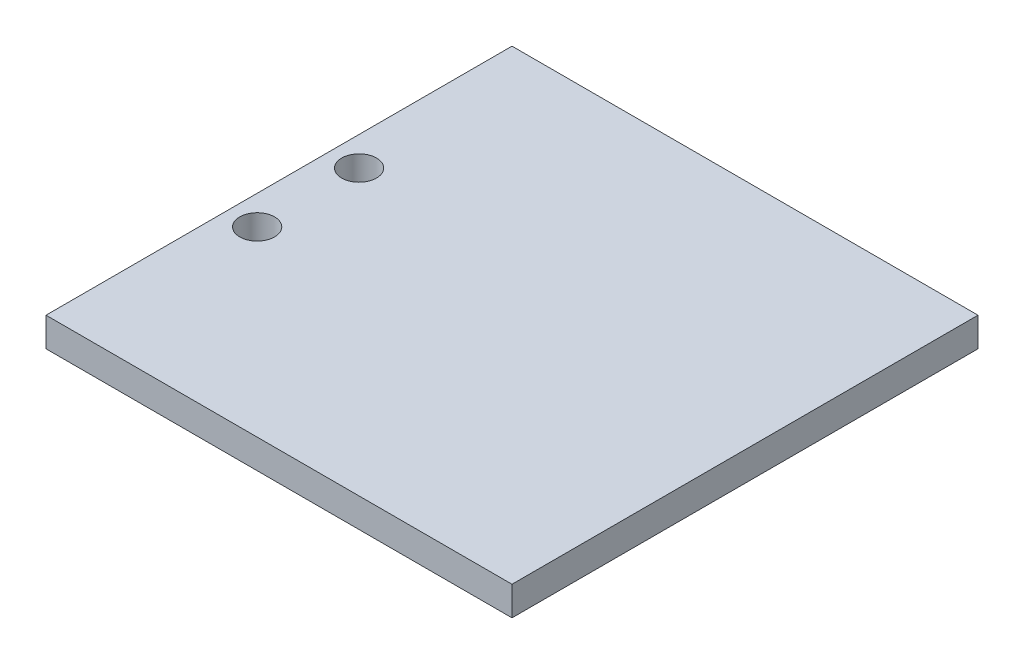
ISO-10303-21;
HEADER;
FILE_DESCRIPTION(('STEP AP214'),'2;1');
FILE_NAME('part.step','',(''),(''),'','','');
FILE_SCHEMA(('AUTOMOTIVE_DESIGN { 1 0 10303 214 1 1 1 1 }'));
ENDSEC;
DATA;
#1=APPLICATION_CONTEXT('core data for automotive mechanical design processes');
#2=APPLICATION_PROTOCOL_DEFINITION('international standard','automotive_design',2000,#1);
#3=PRODUCT_CONTEXT('',#1,'mechanical');
#4=PRODUCT('Part','Part','',(#3));
#5=PRODUCT_RELATED_PRODUCT_CATEGORY('part','',(#4));
#6=PRODUCT_DEFINITION_FORMATION('','',#4);
#7=PRODUCT_DEFINITION_CONTEXT('part definition',#1,'design');
#8=PRODUCT_DEFINITION('design','',#6,#7);
#9=PRODUCT_DEFINITION_SHAPE('','',#8);
#10=(LENGTH_UNIT() NAMED_UNIT(*) SI_UNIT(.MILLI.,.METRE.));
#11=(NAMED_UNIT(*) PLANE_ANGLE_UNIT() SI_UNIT($,.RADIAN.));
#12=(NAMED_UNIT(*) SI_UNIT($,.STERADIAN.) SOLID_ANGLE_UNIT());
#13=UNCERTAINTY_MEASURE_WITH_UNIT(LENGTH_MEASURE(1.E-05),#10,'distance_accuracy_value','');
#14=(GEOMETRIC_REPRESENTATION_CONTEXT(3) GLOBAL_UNCERTAINTY_ASSIGNED_CONTEXT((#13)) GLOBAL_UNIT_ASSIGNED_CONTEXT((#10,
#11,#12)) REPRESENTATION_CONTEXT('',''));
#15=CARTESIAN_POINT('',(0.,0.,0.));
#16=DIRECTION('',(0.,0.,1.));
#17=DIRECTION('',(1.,0.,0.));
#18=AXIS2_PLACEMENT_3D('',#15,#16,#17);
#19=CARTESIAN_POINT('',(25.4,3.175,-25.4));
#20=DIRECTION('',(-1.,0.,0.));
#21=DIRECTION('',(0.,0.,1.));
#22=AXIS2_PLACEMENT_3D('',#19,#20,#21);
#23=PLANE('',#22);
#24=DIRECTION('',(0.,0.,-1.));
#25=VECTOR('',#24,1.);
#26=CARTESIAN_POINT('',(25.4,0.,-25.4));
#27=LINE('',#26,#25);
#28=CARTESIAN_POINT('',(25.4,0.,25.4));
#29=VERTEX_POINT('',#28);
#30=CARTESIAN_POINT('',(25.4,0.,-25.4));
#31=VERTEX_POINT('',#30);
#32=EDGE_CURVE('E108',#29,#31,#27,.T.);
#33=ORIENTED_EDGE('',*,*,#32,.T.);
#34=DIRECTION('',(0.,-1.,0.));
#35=VECTOR('',#34,1.);
#36=CARTESIAN_POINT('',(25.4,3.175,-25.4));
#37=LINE('',#36,#35);
#38=CARTESIAN_POINT('',(25.4,3.175,-25.4));
#39=VERTEX_POINT('',#38);
#40=EDGE_CURVE('E11',#39,#31,#37,.T.);
#41=ORIENTED_EDGE('',*,*,#40,.F.);
#42=DIRECTION('',(0.,0.,-1.));
#43=VECTOR('',#42,1.);
#44=CARTESIAN_POINT('',(25.4,3.175,-25.4));
#45=LINE('',#44,#43);
#46=CARTESIAN_POINT('',(25.4,3.175,25.4));
#47=VERTEX_POINT('',#46);
#48=EDGE_CURVE('E91',#47,#39,#45,.T.);
#49=ORIENTED_EDGE('',*,*,#48,.F.);
#50=DIRECTION('',(0.,-1.,0.));
#51=VECTOR('',#50,1.);
#52=CARTESIAN_POINT('',(25.4,3.175,25.4));
#53=LINE('',#52,#51);
#54=EDGE_CURVE('E104',#47,#29,#53,.T.);
#55=ORIENTED_EDGE('',*,*,#54,.T.);
#56=EDGE_LOOP('',(#33,#41,#49,#55));
#57=FACE_BOUND('',#56,.T.);
#58=ADVANCED_FACE('F38',(#57),#23,.F.);
#59=CARTESIAN_POINT('',(-25.4,3.175,-25.4));
#60=DIRECTION('',(0.,0.,1.));
#61=DIRECTION('',(1.,0.,0.));
#62=AXIS2_PLACEMENT_3D('',#59,#60,#61);
#63=PLANE('',#62);
#64=DIRECTION('',(-1.,0.,0.));
#65=VECTOR('',#64,1.);
#66=CARTESIAN_POINT('',(-25.4,0.,-25.4));
#67=LINE('',#66,#65);
#68=CARTESIAN_POINT('',(-25.4,0.,-25.4));
#69=VERTEX_POINT('',#68);
#70=EDGE_CURVE('E96',#31,#69,#67,.T.);
#71=ORIENTED_EDGE('',*,*,#70,.T.);
#72=DIRECTION('',(0.,-1.,0.));
#73=VECTOR('',#72,1.);
#74=CARTESIAN_POINT('',(-25.4,3.175,-25.4));
#75=LINE('',#74,#73);
#76=CARTESIAN_POINT('',(-25.4,3.175,-25.4));
#77=VERTEX_POINT('',#76);
#78=EDGE_CURVE('E48',#77,#69,#75,.T.);
#79=ORIENTED_EDGE('',*,*,#78,.F.);
#80=DIRECTION('',(-1.,0.,0.));
#81=VECTOR('',#80,1.);
#82=CARTESIAN_POINT('',(-25.4,3.175,-25.4));
#83=LINE('',#82,#81);
#84=EDGE_CURVE('E86',#39,#77,#83,.T.);
#85=ORIENTED_EDGE('',*,*,#84,.F.);
#86=ORIENTED_EDGE('',*,*,#40,.T.);
#87=EDGE_LOOP('',(#71,#79,#85,#86));
#88=FACE_BOUND('',#87,.T.);
#89=ADVANCED_FACE('F95',(#88),#63,.F.);
#90=CARTESIAN_POINT('',(-25.4,3.175,-25.4));
#91=DIRECTION('',(1.,0.,0.));
#92=DIRECTION('',(0.,0.,-1.));
#93=AXIS2_PLACEMENT_3D('',#90,#91,#92);
#94=PLANE('',#93);
#95=DIRECTION('',(0.,0.,1.));
#96=VECTOR('',#95,1.);
#97=CARTESIAN_POINT('',(-25.4,0.,-25.4));
#98=LINE('',#97,#96);
#99=CARTESIAN_POINT('',(-25.4,0.,25.4));
#100=VERTEX_POINT('',#99);
#101=EDGE_CURVE('E73',#69,#100,#98,.T.);
#102=ORIENTED_EDGE('',*,*,#101,.T.);
#103=DIRECTION('',(0.,-1.,0.));
#104=VECTOR('',#103,1.);
#105=CARTESIAN_POINT('',(-25.4,3.175,25.4));
#106=LINE('',#105,#104);
#107=CARTESIAN_POINT('',(-25.4,3.175,25.4));
#108=VERTEX_POINT('',#107);
#109=EDGE_CURVE('E98',#108,#100,#106,.T.);
#110=ORIENTED_EDGE('',*,*,#109,.F.);
#111=DIRECTION('',(0.,0.,1.));
#112=VECTOR('',#111,1.);
#113=CARTESIAN_POINT('',(-25.4,3.175,-25.4));
#114=LINE('',#113,#112);
#115=EDGE_CURVE('E89',#77,#108,#114,.T.);
#116=ORIENTED_EDGE('',*,*,#115,.F.);
#117=ORIENTED_EDGE('',*,*,#78,.T.);
#118=EDGE_LOOP('',(#102,#110,#116,#117));
#119=FACE_BOUND('',#118,.T.);
#120=ADVANCED_FACE('F100',(#119),#94,.F.);
#121=CARTESIAN_POINT('',(-25.4,3.175,25.4));
#122=DIRECTION('',(0.,0.,-1.));
#123=DIRECTION('',(-1.,0.,0.));
#124=AXIS2_PLACEMENT_3D('',#121,#122,#123);
#125=PLANE('',#124);
#126=DIRECTION('',(1.,0.,0.));
#127=VECTOR('',#126,1.);
#128=CARTESIAN_POINT('',(-25.4,0.,25.4));
#129=LINE('',#128,#127);
#130=EDGE_CURVE('E79',#100,#29,#129,.T.);
#131=ORIENTED_EDGE('',*,*,#130,.T.);
#132=ORIENTED_EDGE('',*,*,#54,.F.);
#133=DIRECTION('',(1.,0.,0.));
#134=VECTOR('',#133,1.);
#135=CARTESIAN_POINT('',(-25.4,3.175,25.4));
#136=LINE('',#135,#134);
#137=EDGE_CURVE('E56',#108,#47,#136,.T.);
#138=ORIENTED_EDGE('',*,*,#137,.F.);
#139=ORIENTED_EDGE('',*,*,#109,.T.);
#140=EDGE_LOOP('',(#131,#132,#138,#139));
#141=FACE_BOUND('',#140,.T.);
#142=ADVANCED_FACE('F122',(#141),#125,.F.);
#143=CARTESIAN_POINT('',(0.,3.175,0.));
#144=DIRECTION('',(0.,1.,0.));
#145=DIRECTION('',(0.,0.,1.));
#146=AXIS2_PLACEMENT_3D('',#143,#144,#145);
#147=PLANE('',#146);
#148=CARTESIAN_POINT('',(-22.225,3.175,-5.55625));
#149=DIRECTION('',(0.,1.,0.));
#150=DIRECTION('',(0.,0.,1.));
#151=AXIS2_PLACEMENT_3D('',#148,#149,#150);
#152=CIRCLE('',#151,1.89864999999999);
#153=CARTESIAN_POINT('',(-22.225,3.175,-3.65760000000001));
#154=VERTEX_POINT('',#153);
#155=EDGE_CURVE('E136',#154,#154,#152,.T.);
#156=ORIENTED_EDGE('',*,*,#155,.F.);
#157=EDGE_LOOP('',(#156));
#158=FACE_BOUND('',#157,.T.);
#159=CARTESIAN_POINT('',(-22.225,3.175,5.55625));
#160=DIRECTION('',(0.,1.,0.));
#161=DIRECTION('',(0.,0.,1.));
#162=AXIS2_PLACEMENT_3D('',#159,#160,#161);
#163=CIRCLE('',#162,1.89864999999999);
#164=CARTESIAN_POINT('',(-22.225,3.175,7.45489999999999));
#165=VERTEX_POINT('',#164);
#166=EDGE_CURVE('E132',#165,#165,#163,.T.);
#167=ORIENTED_EDGE('',*,*,#166,.F.);
#168=EDGE_LOOP('',(#167));
#169=FACE_BOUND('',#168,.T.);
#170=ORIENTED_EDGE('',*,*,#48,.T.);
#171=ORIENTED_EDGE('',*,*,#84,.T.);
#172=ORIENTED_EDGE('',*,*,#115,.T.);
#173=ORIENTED_EDGE('',*,*,#137,.T.);
#174=EDGE_LOOP('',(#170,#171,#172,#173));
#175=FACE_BOUND('',#174,.T.);
#176=ADVANCED_FACE('F87',(#158,#169,#175),#147,.T.);
#177=CARTESIAN_POINT('',(0.,0.,0.));
#178=DIRECTION('',(0.,1.,0.));
#179=DIRECTION('',(0.,0.,1.));
#180=AXIS2_PLACEMENT_3D('',#177,#178,#179);
#181=PLANE('',#180);
#182=CARTESIAN_POINT('',(-22.225,0.,-5.55625));
#183=DIRECTION('',(0.,1.,0.));
#184=DIRECTION('',(0.,0.,1.));
#185=AXIS2_PLACEMENT_3D('',#182,#183,#184);
#186=CIRCLE('',#185,1.89864999999999);
#187=CARTESIAN_POINT('',(-22.225,0.,-3.65760000000001));
#188=VERTEX_POINT('',#187);
#189=EDGE_CURVE('E41',#188,#188,#186,.T.);
#190=ORIENTED_EDGE('',*,*,#189,.T.);
#191=EDGE_LOOP('',(#190));
#192=FACE_BOUND('',#191,.T.);
#193=CARTESIAN_POINT('',(-22.225,0.,5.55625));
#194=DIRECTION('',(0.,1.,0.));
#195=DIRECTION('',(0.,0.,1.));
#196=AXIS2_PLACEMENT_3D('',#193,#194,#195);
#197=CIRCLE('',#196,1.89864999999999);
#198=CARTESIAN_POINT('',(-22.225,0.,7.45489999999999));
#199=VERTEX_POINT('',#198);
#200=EDGE_CURVE('E112',#199,#199,#197,.T.);
#201=ORIENTED_EDGE('',*,*,#200,.T.);
#202=EDGE_LOOP('',(#201));
#203=FACE_BOUND('',#202,.T.);
#204=ORIENTED_EDGE('',*,*,#32,.F.);
#205=ORIENTED_EDGE('',*,*,#130,.F.);
#206=ORIENTED_EDGE('',*,*,#101,.F.);
#207=ORIENTED_EDGE('',*,*,#70,.F.);
#208=EDGE_LOOP('',(#204,#205,#206,#207));
#209=FACE_BOUND('',#208,.T.);
#210=ADVANCED_FACE('F125',(#192,#203,#209),#181,.F.);
#211=CARTESIAN_POINT('',(-22.225,3.175,5.55625));
#212=DIRECTION('',(0.,1.,0.));
#213=DIRECTION('',(0.,0.,1.));
#214=AXIS2_PLACEMENT_3D('',#211,#212,#213);
#215=CYLINDRICAL_SURFACE('',#214,1.89864999999999);
#216=ORIENTED_EDGE('',*,*,#166,.T.);
#217=EDGE_LOOP('',(#216));
#218=FACE_BOUND('',#217,.T.);
#219=ORIENTED_EDGE('',*,*,#200,.F.);
#220=EDGE_LOOP('',(#219));
#221=FACE_BOUND('',#220,.T.);
#222=ADVANCED_FACE('F149',(#218,#221),#215,.F.);
#223=CARTESIAN_POINT('',(-22.225,3.175,-5.55625));
#224=DIRECTION('',(0.,1.,0.));
#225=DIRECTION('',(0.,0.,1.));
#226=AXIS2_PLACEMENT_3D('',#223,#224,#225);
#227=CYLINDRICAL_SURFACE('',#226,1.89864999999999);
#228=ORIENTED_EDGE('',*,*,#155,.T.);
#229=EDGE_LOOP('',(#228));
#230=FACE_BOUND('',#229,.T.);
#231=ORIENTED_EDGE('',*,*,#189,.F.);
#232=EDGE_LOOP('',(#231));
#233=FACE_BOUND('',#232,.T.);
#234=ADVANCED_FACE('F147',(#230,#233),#227,.F.);
#235=CLOSED_SHELL('',(#58,#89,#120,#142,#176,#210,#222,#234));
#236=MANIFOLD_SOLID_BREP('B2',#235);
#237=ADVANCED_BREP_SHAPE_REPRESENTATION('',(#18,#236),#14);
#238=SHAPE_DEFINITION_REPRESENTATION(#9,#237);
ENDSEC;
END-ISO-10303-21;
